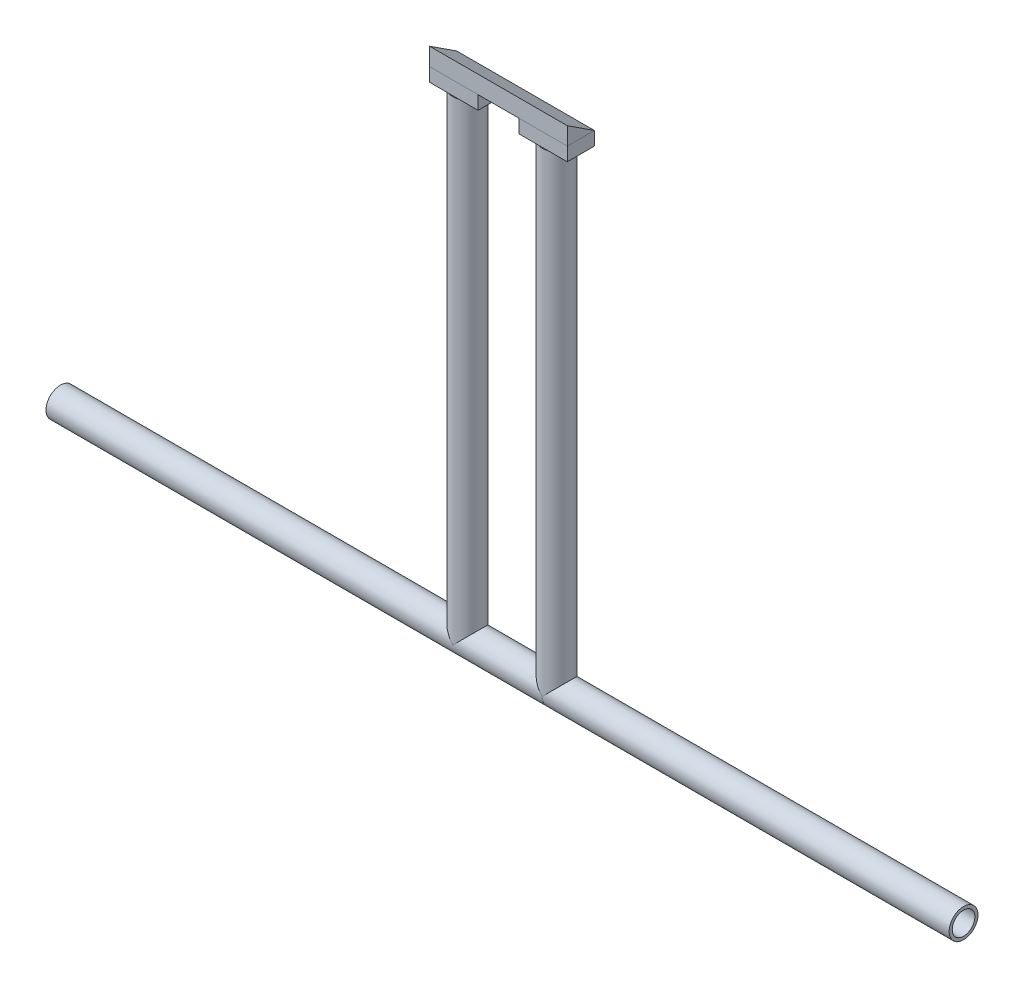
ISO-10303-21;
HEADER;
FILE_DESCRIPTION(('STEP AP214'),'2;1');
FILE_NAME('part.step','',(''),(''),'','','');
FILE_SCHEMA(('AUTOMOTIVE_DESIGN { 1 0 10303 214 1 1 1 1 }'));
ENDSEC;
DATA;
#1=APPLICATION_CONTEXT('core data for automotive mechanical design processes');
#2=APPLICATION_PROTOCOL_DEFINITION('international standard','automotive_design',2000,#1);
#3=PRODUCT_CONTEXT('',#1,'mechanical');
#4=PRODUCT('Part','Part','',(#3));
#5=PRODUCT_RELATED_PRODUCT_CATEGORY('part','',(#4));
#6=PRODUCT_DEFINITION_FORMATION('','',#4);
#7=PRODUCT_DEFINITION_CONTEXT('part definition',#1,'design');
#8=PRODUCT_DEFINITION('design','',#6,#7);
#9=PRODUCT_DEFINITION_SHAPE('','',#8);
#10=(LENGTH_UNIT() NAMED_UNIT(*) SI_UNIT(.MILLI.,.METRE.));
#11=(NAMED_UNIT(*) PLANE_ANGLE_UNIT() SI_UNIT($,.RADIAN.));
#12=(NAMED_UNIT(*) SI_UNIT($,.STERADIAN.) SOLID_ANGLE_UNIT());
#13=UNCERTAINTY_MEASURE_WITH_UNIT(LENGTH_MEASURE(1.E-05),#10,'distance_accuracy_value','');
#14=(GEOMETRIC_REPRESENTATION_CONTEXT(3) GLOBAL_UNCERTAINTY_ASSIGNED_CONTEXT((#13)) GLOBAL_UNIT_ASSIGNED_CONTEXT((#10,
#11,#12)) REPRESENTATION_CONTEXT('',''));
#15=CARTESIAN_POINT('',(0.,0.,0.));
#16=DIRECTION('',(0.,0.,1.));
#17=DIRECTION('',(1.,0.,0.));
#18=AXIS2_PLACEMENT_3D('',#15,#16,#17);
#19=CARTESIAN_POINT('',(41.7485920944329,360.,10.));
#20=DIRECTION('',(0.,-1.,0.));
#21=DIRECTION('',(0.,0.,-1.));
#22=AXIS2_PLACEMENT_3D('',#19,#20,#21);
#23=PLANE('',#22);
#24=DIRECTION('',(0.,0.,-1.));
#25=VECTOR('',#24,1.);
#26=CARTESIAN_POINT('',(17.875,360.,10.));
#27=LINE('',#26,#25);
#28=CARTESIAN_POINT('',(17.875,360.,10.));
#29=VERTEX_POINT('',#28);
#30=CARTESIAN_POINT('',(17.875,360.,-9.99999999999999));
#31=VERTEX_POINT('',#30);
#32=EDGE_CURVE('E67',#29,#31,#27,.T.);
#33=ORIENTED_EDGE('',*,*,#32,.F.);
#34=DIRECTION('',(-1.,0.,0.));
#35=VECTOR('',#34,1.);
#36=CARTESIAN_POINT('',(41.7485920944329,360.,10.));
#37=LINE('',#36,#35);
#38=CARTESIAN_POINT('',(-83.625,360.,10.));
#39=VERTEX_POINT('',#38);
#40=EDGE_CURVE('E89',#29,#39,#37,.T.);
#41=ORIENTED_EDGE('',*,*,#40,.T.);
#42=DIRECTION('',(0.,0.,1.));
#43=VECTOR('',#42,1.);
#44=CARTESIAN_POINT('',(-83.625,360.,10.));
#45=LINE('',#44,#43);
#46=CARTESIAN_POINT('',(-83.625,360.,-10.));
#47=VERTEX_POINT('',#46);
#48=EDGE_CURVE('E93',#47,#39,#45,.T.);
#49=ORIENTED_EDGE('',*,*,#48,.F.);
#50=DIRECTION('',(-1.,0.,0.));
#51=VECTOR('',#50,1.);
#52=CARTESIAN_POINT('',(41.7485920944329,360.,-10.));
#53=LINE('',#52,#51);
#54=EDGE_CURVE('E111',#31,#47,#53,.T.);
#55=ORIENTED_EDGE('',*,*,#54,.F.);
#56=EDGE_LOOP('',(#33,#41,#49,#55));
#57=FACE_BOUND('',#56,.T.);
#58=ADVANCED_FACE('F60',(#57),#23,.T.);
#59=CARTESIAN_POINT('',(41.7485920944329,373.036425871049,10.));
#60=DIRECTION('',(0.,0.837745736832952,-0.546060509850525));
#61=DIRECTION('',(0.,0.546060509850525,0.837745736832952));
#62=AXIS2_PLACEMENT_3D('',#59,#60,#61);
#63=PLANE('',#62);
#64=DIRECTION('',(0.,0.546060509850525,0.837745736832952));
#65=VECTOR('',#64,1.);
#66=CARTESIAN_POINT('',(17.875,373.036425871049,10.));
#67=LINE('',#66,#65);
#68=CARTESIAN_POINT('',(17.875,373.036425871049,10.));
#69=VERTEX_POINT('',#68);
#70=EDGE_CURVE('E113',#31,#69,#67,.T.);
#71=ORIENTED_EDGE('',*,*,#70,.F.);
#72=ORIENTED_EDGE('',*,*,#54,.T.);
#73=DIRECTION('',(0.,-0.546060509850525,-0.837745736832952));
#74=VECTOR('',#73,1.);
#75=CARTESIAN_POINT('',(-83.625,373.036425871049,10.));
#76=LINE('',#75,#74);
#77=CARTESIAN_POINT('',(-83.625,373.036425871049,10.));
#78=VERTEX_POINT('',#77);
#79=EDGE_CURVE('E97',#78,#47,#76,.T.);
#80=ORIENTED_EDGE('',*,*,#79,.F.);
#81=DIRECTION('',(-1.,0.,0.));
#82=VECTOR('',#81,1.);
#83=CARTESIAN_POINT('',(41.7485920944329,373.036425871049,10.));
#84=LINE('',#83,#82);
#85=EDGE_CURVE('E96',#69,#78,#84,.T.);
#86=ORIENTED_EDGE('',*,*,#85,.F.);
#87=EDGE_LOOP('',(#71,#72,#80,#86));
#88=FACE_BOUND('',#87,.T.);
#89=ADVANCED_FACE('F116',(#88),#63,.T.);
#90=CARTESIAN_POINT('',(41.7485920944329,360.,10.));
#91=DIRECTION('',(0.,0.,1.));
#92=DIRECTION('',(1.,0.,0.));
#93=AXIS2_PLACEMENT_3D('',#90,#91,#92);
#94=PLANE('',#93);
#95=DIRECTION('',(0.,-1.,0.));
#96=VECTOR('',#95,1.);
#97=CARTESIAN_POINT('',(17.875,360.,10.));
#98=LINE('',#97,#96);
#99=EDGE_CURVE('E13',#69,#29,#98,.T.);
#100=ORIENTED_EDGE('',*,*,#99,.F.);
#101=ORIENTED_EDGE('',*,*,#85,.T.);
#102=DIRECTION('',(0.,1.,0.));
#103=VECTOR('',#102,1.);
#104=CARTESIAN_POINT('',(-83.625,360.,10.));
#105=LINE('',#104,#103);
#106=EDGE_CURVE('E99',#39,#78,#105,.T.);
#107=ORIENTED_EDGE('',*,*,#106,.F.);
#108=ORIENTED_EDGE('',*,*,#40,.F.);
#109=EDGE_LOOP('',(#100,#101,#107,#108));
#110=FACE_BOUND('',#109,.T.);
#111=ADVANCED_FACE('F100',(#110),#94,.T.);
#112=CARTESIAN_POINT('',(-83.625,0.,0.));
#113=DIRECTION('',(1.,0.,0.));
#114=DIRECTION('',(0.,0.,-1.));
#115=AXIS2_PLACEMENT_3D('',#112,#113,#114);
#116=PLANE('',#115);
#117=ORIENTED_EDGE('',*,*,#48,.T.);
#118=ORIENTED_EDGE('',*,*,#106,.T.);
#119=ORIENTED_EDGE('',*,*,#79,.T.);
#120=EDGE_LOOP('',(#117,#118,#119));
#121=FACE_BOUND('',#120,.T.);
#122=ADVANCED_FACE('F105',(#121),#116,.F.);
#123=CARTESIAN_POINT('',(17.875,360.,-10.));
#124=DIRECTION('',(-1.,0.,0.));
#125=DIRECTION('',(0.,0.,1.));
#126=AXIS2_PLACEMENT_3D('',#123,#124,#125);
#127=PLANE('',#126);
#128=ORIENTED_EDGE('',*,*,#32,.T.);
#129=ORIENTED_EDGE('',*,*,#70,.T.);
#130=ORIENTED_EDGE('',*,*,#99,.T.);
#131=EDGE_LOOP('',(#128,#129,#130));
#132=FACE_BOUND('',#131,.T.);
#133=ADVANCED_FACE('F115',(#132),#127,.F.);
#134=CLOSED_SHELL('',(#58,#89,#111,#122,#133));
#135=MANIFOLD_SOLID_BREP('B2',#134);
#136=CARTESIAN_POINT('',(17.875,360.,-10.));
#137=DIRECTION('',(-1.,0.,0.));
#138=DIRECTION('',(0.,0.,1.));
#139=AXIS2_PLACEMENT_3D('',#136,#137,#138);
#140=PLANE('',#139);
#141=DIRECTION('',(0.,0.,-1.));
#142=VECTOR('',#141,1.);
#143=CARTESIAN_POINT('',(17.875,350.,-10.));
#144=LINE('',#143,#142);
#145=CARTESIAN_POINT('',(17.875,350.,10.));
#146=VERTEX_POINT('',#145);
#147=CARTESIAN_POINT('',(17.875,350.,-10.));
#148=VERTEX_POINT('',#147);
#149=EDGE_CURVE('E231',#146,#148,#144,.T.);
#150=ORIENTED_EDGE('',*,*,#149,.T.);
#151=DIRECTION('',(0.,-1.,0.));
#152=VECTOR('',#151,1.);
#153=CARTESIAN_POINT('',(17.875,360.,-10.));
#154=LINE('',#153,#152);
#155=CARTESIAN_POINT('',(17.875,360.,-10.));
#156=VERTEX_POINT('',#155);
#157=EDGE_CURVE('E58',#156,#148,#154,.T.);
#158=ORIENTED_EDGE('',*,*,#157,.F.);
#159=DIRECTION('',(0.,0.,-1.));
#160=VECTOR('',#159,1.);
#161=CARTESIAN_POINT('',(17.875,360.,-10.));
#162=LINE('',#161,#160);
#163=CARTESIAN_POINT('',(17.875,360.,10.));
#164=VERTEX_POINT('',#163);
#165=EDGE_CURVE('E219',#164,#156,#162,.T.);
#166=ORIENTED_EDGE('',*,*,#165,.F.);
#167=DIRECTION('',(0.,-1.,0.));
#168=VECTOR('',#167,1.);
#169=CARTESIAN_POINT('',(17.875,360.,10.));
#170=LINE('',#169,#168);
#171=EDGE_CURVE('E227',#164,#146,#170,.T.);
#172=ORIENTED_EDGE('',*,*,#171,.T.);
#173=EDGE_LOOP('',(#150,#158,#166,#172));
#174=FACE_BOUND('',#173,.T.);
#175=ADVANCED_FACE('F168',(#174),#140,.F.);
#176=CARTESIAN_POINT('',(-17.875,360.,-10.));
#177=DIRECTION('',(0.,0.,1.));
#178=DIRECTION('',(1.,0.,0.));
#179=AXIS2_PLACEMENT_3D('',#176,#177,#178);
#180=PLANE('',#179);
#181=DIRECTION('',(-1.,0.,0.));
#182=VECTOR('',#181,1.);
#183=CARTESIAN_POINT('',(-17.875,350.,-10.));
#184=LINE('',#183,#182);
#185=CARTESIAN_POINT('',(-17.875,350.,-10.));
#186=VERTEX_POINT('',#185);
#187=EDGE_CURVE('E223',#148,#186,#184,.T.);
#188=ORIENTED_EDGE('',*,*,#187,.T.);
#189=DIRECTION('',(0.,-1.,0.));
#190=VECTOR('',#189,1.);
#191=CARTESIAN_POINT('',(-17.875,360.,-10.));
#192=LINE('',#191,#190);
#193=CARTESIAN_POINT('',(-17.875,360.,-10.));
#194=VERTEX_POINT('',#193);
#195=EDGE_CURVE('E176',#194,#186,#192,.T.);
#196=ORIENTED_EDGE('',*,*,#195,.F.);
#197=DIRECTION('',(-1.,0.,0.));
#198=VECTOR('',#197,1.);
#199=CARTESIAN_POINT('',(-17.875,360.,-10.));
#200=LINE('',#199,#198);
#201=EDGE_CURVE('E214',#156,#194,#200,.T.);
#202=ORIENTED_EDGE('',*,*,#201,.F.);
#203=ORIENTED_EDGE('',*,*,#157,.T.);
#204=EDGE_LOOP('',(#188,#196,#202,#203));
#205=FACE_BOUND('',#204,.T.);
#206=ADVANCED_FACE('F222',(#205),#180,.F.);
#207=CARTESIAN_POINT('',(-17.875,360.,-10.));
#208=DIRECTION('',(1.,0.,0.));
#209=DIRECTION('',(0.,0.,-1.));
#210=AXIS2_PLACEMENT_3D('',#207,#208,#209);
#211=PLANE('',#210);
#212=DIRECTION('',(0.,0.,1.));
#213=VECTOR('',#212,1.);
#214=CARTESIAN_POINT('',(-17.875,350.,-10.));
#215=LINE('',#214,#213);
#216=CARTESIAN_POINT('',(-17.875,350.,10.));
#217=VERTEX_POINT('',#216);
#218=EDGE_CURVE('E201',#186,#217,#215,.T.);
#219=ORIENTED_EDGE('',*,*,#218,.T.);
#220=DIRECTION('',(0.,-1.,0.));
#221=VECTOR('',#220,1.);
#222=CARTESIAN_POINT('',(-17.875,360.,10.));
#223=LINE('',#222,#221);
#224=CARTESIAN_POINT('',(-17.875,360.,10.));
#225=VERTEX_POINT('',#224);
#226=EDGE_CURVE('E224',#225,#217,#223,.T.);
#227=ORIENTED_EDGE('',*,*,#226,.F.);
#228=DIRECTION('',(0.,0.,1.));
#229=VECTOR('',#228,1.);
#230=CARTESIAN_POINT('',(-17.875,360.,-10.));
#231=LINE('',#230,#229);
#232=EDGE_CURVE('E217',#194,#225,#231,.T.);
#233=ORIENTED_EDGE('',*,*,#232,.F.);
#234=ORIENTED_EDGE('',*,*,#195,.T.);
#235=EDGE_LOOP('',(#219,#227,#233,#234));
#236=FACE_BOUND('',#235,.T.);
#237=ADVANCED_FACE('F225',(#236),#211,.F.);
#238=CARTESIAN_POINT('',(-17.875,360.,10.));
#239=DIRECTION('',(0.,0.,-1.));
#240=DIRECTION('',(-1.,0.,0.));
#241=AXIS2_PLACEMENT_3D('',#238,#239,#240);
#242=PLANE('',#241);
#243=DIRECTION('',(1.,0.,0.));
#244=VECTOR('',#243,1.);
#245=CARTESIAN_POINT('',(-17.875,350.,10.));
#246=LINE('',#245,#244);
#247=EDGE_CURVE('E207',#217,#146,#246,.T.);
#248=ORIENTED_EDGE('',*,*,#247,.T.);
#249=ORIENTED_EDGE('',*,*,#171,.F.);
#250=DIRECTION('',(1.,0.,0.));
#251=VECTOR('',#250,1.);
#252=CARTESIAN_POINT('',(-17.875,360.,10.));
#253=LINE('',#252,#251);
#254=EDGE_CURVE('E184',#225,#164,#253,.T.);
#255=ORIENTED_EDGE('',*,*,#254,.F.);
#256=ORIENTED_EDGE('',*,*,#226,.T.);
#257=EDGE_LOOP('',(#248,#249,#255,#256));
#258=FACE_BOUND('',#257,.T.);
#259=ADVANCED_FACE('F238',(#258),#242,.F.);
#260=CARTESIAN_POINT('',(0.,360.,0.));
#261=DIRECTION('',(0.,1.,0.));
#262=DIRECTION('',(0.,0.,1.));
#263=AXIS2_PLACEMENT_3D('',#260,#261,#262);
#264=PLANE('',#263);
#265=ORIENTED_EDGE('',*,*,#165,.T.);
#266=ORIENTED_EDGE('',*,*,#201,.T.);
#267=ORIENTED_EDGE('',*,*,#232,.T.);
#268=ORIENTED_EDGE('',*,*,#254,.T.);
#269=EDGE_LOOP('',(#265,#266,#267,#268));
#270=FACE_BOUND('',#269,.T.);
#271=ADVANCED_FACE('F215',(#270),#264,.T.);
#272=CARTESIAN_POINT('',(0.,350.,0.));
#273=DIRECTION('',(0.,1.,0.));
#274=DIRECTION('',(0.,0.,1.));
#275=AXIS2_PLACEMENT_3D('',#272,#273,#274);
#276=PLANE('',#275);
#277=ORIENTED_EDGE('',*,*,#149,.F.);
#278=ORIENTED_EDGE('',*,*,#247,.F.);
#279=ORIENTED_EDGE('',*,*,#218,.F.);
#280=ORIENTED_EDGE('',*,*,#187,.F.);
#281=EDGE_LOOP('',(#277,#278,#279,#280));
#282=FACE_BOUND('',#281,.T.);
#283=ADVANCED_FACE('F241',(#282),#276,.F.);
#284=CLOSED_SHELL('',(#175,#206,#237,#259,#271,#283));
#285=MANIFOLD_SOLID_BREP('B7',#284);
#286=CARTESIAN_POINT('',(-47.875,360.,-10.));
#287=DIRECTION('',(-1.,0.,0.));
#288=DIRECTION('',(0.,0.,1.));
#289=AXIS2_PLACEMENT_3D('',#286,#287,#288);
#290=PLANE('',#289);
#291=DIRECTION('',(0.,0.,-1.));
#292=VECTOR('',#291,1.);
#293=CARTESIAN_POINT('',(-47.875,350.,-10.));
#294=LINE('',#293,#292);
#295=CARTESIAN_POINT('',(-47.875,350.,10.));
#296=VERTEX_POINT('',#295);
#297=CARTESIAN_POINT('',(-47.875,350.,-10.));
#298=VERTEX_POINT('',#297);
#299=EDGE_CURVE('E351',#296,#298,#294,.T.);
#300=ORIENTED_EDGE('',*,*,#299,.T.);
#301=DIRECTION('',(0.,-1.,0.));
#302=VECTOR('',#301,1.);
#303=CARTESIAN_POINT('',(-47.875,360.,-10.));
#304=LINE('',#303,#302);
#305=CARTESIAN_POINT('',(-47.875,360.,-10.));
#306=VERTEX_POINT('',#305);
#307=EDGE_CURVE('E166',#306,#298,#304,.T.);
#308=ORIENTED_EDGE('',*,*,#307,.F.);
#309=DIRECTION('',(0.,0.,-1.));
#310=VECTOR('',#309,1.);
#311=CARTESIAN_POINT('',(-47.875,360.,-10.));
#312=LINE('',#311,#310);
#313=CARTESIAN_POINT('',(-47.875,360.,10.));
#314=VERTEX_POINT('',#313);
#315=EDGE_CURVE('E339',#314,#306,#312,.T.);
#316=ORIENTED_EDGE('',*,*,#315,.F.);
#317=DIRECTION('',(0.,-1.,0.));
#318=VECTOR('',#317,1.);
#319=CARTESIAN_POINT('',(-47.875,360.,10.));
#320=LINE('',#319,#318);
#321=EDGE_CURVE('E347',#314,#296,#320,.T.);
#322=ORIENTED_EDGE('',*,*,#321,.T.);
#323=EDGE_LOOP('',(#300,#308,#316,#322));
#324=FACE_BOUND('',#323,.T.);
#325=ADVANCED_FACE('F288',(#324),#290,.F.);
#326=CARTESIAN_POINT('',(-83.625,360.,-10.));
#327=DIRECTION('',(0.,0.,1.));
#328=DIRECTION('',(1.,0.,0.));
#329=AXIS2_PLACEMENT_3D('',#326,#327,#328);
#330=PLANE('',#329);
#331=DIRECTION('',(-1.,0.,0.));
#332=VECTOR('',#331,1.);
#333=CARTESIAN_POINT('',(-83.625,350.,-10.));
#334=LINE('',#333,#332);
#335=CARTESIAN_POINT('',(-83.625,350.,-10.));
#336=VERTEX_POINT('',#335);
#337=EDGE_CURVE('E343',#298,#336,#334,.T.);
#338=ORIENTED_EDGE('',*,*,#337,.T.);
#339=DIRECTION('',(0.,-1.,0.));
#340=VECTOR('',#339,1.);
#341=CARTESIAN_POINT('',(-83.625,360.,-10.));
#342=LINE('',#341,#340);
#343=CARTESIAN_POINT('',(-83.625,360.,-10.));
#344=VERTEX_POINT('',#343);
#345=EDGE_CURVE('E296',#344,#336,#342,.T.);
#346=ORIENTED_EDGE('',*,*,#345,.F.);
#347=DIRECTION('',(-1.,0.,0.));
#348=VECTOR('',#347,1.);
#349=CARTESIAN_POINT('',(-83.625,360.,-10.));
#350=LINE('',#349,#348);
#351=EDGE_CURVE('E334',#306,#344,#350,.T.);
#352=ORIENTED_EDGE('',*,*,#351,.F.);
#353=ORIENTED_EDGE('',*,*,#307,.T.);
#354=EDGE_LOOP('',(#338,#346,#352,#353));
#355=FACE_BOUND('',#354,.T.);
#356=ADVANCED_FACE('F342',(#355),#330,.F.);
#357=CARTESIAN_POINT('',(-83.625,360.,-10.));
#358=DIRECTION('',(1.,0.,0.));
#359=DIRECTION('',(0.,0.,-1.));
#360=AXIS2_PLACEMENT_3D('',#357,#358,#359);
#361=PLANE('',#360);
#362=DIRECTION('',(0.,0.,1.));
#363=VECTOR('',#362,1.);
#364=CARTESIAN_POINT('',(-83.625,350.,-10.));
#365=LINE('',#364,#363);
#366=CARTESIAN_POINT('',(-83.625,350.,10.));
#367=VERTEX_POINT('',#366);
#368=EDGE_CURVE('E321',#336,#367,#365,.T.);
#369=ORIENTED_EDGE('',*,*,#368,.T.);
#370=DIRECTION('',(0.,-1.,0.));
#371=VECTOR('',#370,1.);
#372=CARTESIAN_POINT('',(-83.625,360.,10.));
#373=LINE('',#372,#371);
#374=CARTESIAN_POINT('',(-83.625,360.,10.));
#375=VERTEX_POINT('',#374);
#376=EDGE_CURVE('E344',#375,#367,#373,.T.);
#377=ORIENTED_EDGE('',*,*,#376,.F.);
#378=DIRECTION('',(0.,0.,1.));
#379=VECTOR('',#378,1.);
#380=CARTESIAN_POINT('',(-83.625,360.,-10.));
#381=LINE('',#380,#379);
#382=EDGE_CURVE('E337',#344,#375,#381,.T.);
#383=ORIENTED_EDGE('',*,*,#382,.F.);
#384=ORIENTED_EDGE('',*,*,#345,.T.);
#385=EDGE_LOOP('',(#369,#377,#383,#384));
#386=FACE_BOUND('',#385,.T.);
#387=ADVANCED_FACE('F345',(#386),#361,.F.);
#388=CARTESIAN_POINT('',(-83.625,360.,10.));
#389=DIRECTION('',(0.,0.,-1.));
#390=DIRECTION('',(-1.,0.,0.));
#391=AXIS2_PLACEMENT_3D('',#388,#389,#390);
#392=PLANE('',#391);
#393=DIRECTION('',(1.,0.,0.));
#394=VECTOR('',#393,1.);
#395=CARTESIAN_POINT('',(-83.625,350.,10.));
#396=LINE('',#395,#394);
#397=EDGE_CURVE('E327',#367,#296,#396,.T.);
#398=ORIENTED_EDGE('',*,*,#397,.T.);
#399=ORIENTED_EDGE('',*,*,#321,.F.);
#400=DIRECTION('',(1.,0.,0.));
#401=VECTOR('',#400,1.);
#402=CARTESIAN_POINT('',(-83.625,360.,10.));
#403=LINE('',#402,#401);
#404=EDGE_CURVE('E304',#375,#314,#403,.T.);
#405=ORIENTED_EDGE('',*,*,#404,.F.);
#406=ORIENTED_EDGE('',*,*,#376,.T.);
#407=EDGE_LOOP('',(#398,#399,#405,#406));
#408=FACE_BOUND('',#407,.T.);
#409=ADVANCED_FACE('F358',(#408),#392,.F.);
#410=CARTESIAN_POINT('',(0.,360.,0.));
#411=DIRECTION('',(0.,1.,0.));
#412=DIRECTION('',(0.,0.,1.));
#413=AXIS2_PLACEMENT_3D('',#410,#411,#412);
#414=PLANE('',#413);
#415=ORIENTED_EDGE('',*,*,#315,.T.);
#416=ORIENTED_EDGE('',*,*,#351,.T.);
#417=ORIENTED_EDGE('',*,*,#382,.T.);
#418=ORIENTED_EDGE('',*,*,#404,.T.);
#419=EDGE_LOOP('',(#415,#416,#417,#418));
#420=FACE_BOUND('',#419,.T.);
#421=ADVANCED_FACE('F335',(#420),#414,.T.);
#422=CARTESIAN_POINT('',(0.,350.,0.));
#423=DIRECTION('',(0.,1.,0.));
#424=DIRECTION('',(0.,0.,1.));
#425=AXIS2_PLACEMENT_3D('',#422,#423,#424);
#426=PLANE('',#425);
#427=ORIENTED_EDGE('',*,*,#299,.F.);
#428=ORIENTED_EDGE('',*,*,#397,.F.);
#429=ORIENTED_EDGE('',*,*,#368,.F.);
#430=ORIENTED_EDGE('',*,*,#337,.F.);
#431=EDGE_LOOP('',(#427,#428,#429,#430));
#432=FACE_BOUND('',#431,.T.);
#433=ADVANCED_FACE('F361',(#432),#426,.F.);
#434=CLOSED_SHELL('',(#325,#356,#387,#409,#421,#433));
#435=MANIFOLD_SOLID_BREP('B52',#434);
#436=CARTESIAN_POINT('',(0.,0.,0.));
#437=DIRECTION('',(1.,0.,0.));
#438=DIRECTION('',(0.,1.,0.));
#439=AXIS2_PLACEMENT_3D('',#436,#437,#438);
#440=CYLINDRICAL_SURFACE('',#439,8.35);
#441=CARTESIAN_POINT('',(300.,0.,0.));
#442=DIRECTION('',(-1.,0.,0.));
#443=DIRECTION('',(0.,-1.,0.));
#444=AXIS2_PLACEMENT_3D('',#441,#442,#443);
#445=CIRCLE('',#444,8.35);
#446=CARTESIAN_POINT('',(300.,-8.35,0.));
#447=VERTEX_POINT('',#446);
#448=EDGE_CURVE('E415',#447,#447,#445,.T.);
#449=ORIENTED_EDGE('',*,*,#448,.F.);
#450=EDGE_LOOP('',(#449));
#451=FACE_BOUND('',#450,.T.);
#452=CARTESIAN_POINT('',(0.,0.,0.));
#453=DIRECTION('',(-1.,0.,0.));
#454=DIRECTION('',(0.,-1.,0.));
#455=AXIS2_PLACEMENT_3D('',#452,#453,#454);
#456=CIRCLE('',#455,8.35);
#457=CARTESIAN_POINT('',(0.,-8.35,0.));
#458=VERTEX_POINT('',#457);
#459=EDGE_CURVE('E411',#458,#458,#456,.T.);
#460=ORIENTED_EDGE('',*,*,#459,.T.);
#461=EDGE_LOOP('',(#460));
#462=FACE_BOUND('',#461,.T.);
#463=ADVANCED_FACE('F407',(#451,#462),#440,.F.);
#464=CARTESIAN_POINT('',(0.,0.,0.));
#465=DIRECTION('',(1.,0.,0.));
#466=DIRECTION('',(0.,1.,0.));
#467=AXIS2_PLACEMENT_3D('',#464,#465,#466);
#468=CYLINDRICAL_SURFACE('',#467,10.65);
#469=CARTESIAN_POINT('',(300.,0.,0.));
#470=DIRECTION('',(-1.,0.,0.));
#471=DIRECTION('',(0.,-1.,0.));
#472=AXIS2_PLACEMENT_3D('',#469,#470,#471);
#473=CIRCLE('',#472,10.65);
#474=CARTESIAN_POINT('',(300.,-10.65,0.));
#475=VERTEX_POINT('',#474);
#476=EDGE_CURVE('E419',#475,#475,#473,.T.);
#477=ORIENTED_EDGE('',*,*,#476,.T.);
#478=EDGE_LOOP('',(#477));
#479=FACE_BOUND('',#478,.T.);
#480=CARTESIAN_POINT('',(0.,0.,0.));
#481=DIRECTION('',(-1.,0.,0.));
#482=DIRECTION('',(0.,-1.,0.));
#483=AXIS2_PLACEMENT_3D('',#480,#481,#482);
#484=CIRCLE('',#483,10.65);
#485=CARTESIAN_POINT('',(0.,-10.65,0.));
#486=VERTEX_POINT('',#485);
#487=EDGE_CURVE('E287',#486,#486,#484,.T.);
#488=ORIENTED_EDGE('',*,*,#487,.F.);
#489=EDGE_LOOP('',(#488));
#490=FACE_BOUND('',#489,.T.);
#491=ADVANCED_FACE('F434',(#479,#490),#468,.T.);
#492=CARTESIAN_POINT('',(300.,0.,0.));
#493=DIRECTION('',(-1.,0.,0.));
#494=DIRECTION('',(0.,-1.,0.));
#495=AXIS2_PLACEMENT_3D('',#492,#493,#494);
#496=PLANE('',#495);
#497=ORIENTED_EDGE('',*,*,#448,.T.);
#498=EDGE_LOOP('',(#497));
#499=FACE_BOUND('',#498,.T.);
#500=ORIENTED_EDGE('',*,*,#476,.F.);
#501=EDGE_LOOP('',(#500));
#502=FACE_BOUND('',#501,.T.);
#503=ADVANCED_FACE('F430',(#499,#502),#496,.F.);
#504=CARTESIAN_POINT('',(0.,0.,0.));
#505=DIRECTION('',(-1.,0.,0.));
#506=DIRECTION('',(0.,-1.,0.));
#507=AXIS2_PLACEMENT_3D('',#504,#505,#506);
#508=PLANE('',#507);
#509=ORIENTED_EDGE('',*,*,#459,.F.);
#510=EDGE_LOOP('',(#509));
#511=FACE_BOUND('',#510,.T.);
#512=ORIENTED_EDGE('',*,*,#487,.T.);
#513=EDGE_LOOP('',(#512));
#514=FACE_BOUND('',#513,.T.);
#515=ADVANCED_FACE('F409',(#511,#514),#508,.T.);
#516=CLOSED_SHELL('',(#463,#491,#503,#515));
#517=MANIFOLD_SOLID_BREP('B160',#516);
#518=CARTESIAN_POINT('',(-365.75,0.,0.));
#519=DIRECTION('',(1.,0.,0.));
#520=DIRECTION('',(0.,1.,0.));
#521=AXIS2_PLACEMENT_3D('',#518,#519,#520);
#522=CYLINDRICAL_SURFACE('',#521,8.35);
#523=CARTESIAN_POINT('',(-365.75,0.,0.));
#524=DIRECTION('',(-1.,0.,0.));
#525=DIRECTION('',(0.,-1.,0.));
#526=AXIS2_PLACEMENT_3D('',#523,#524,#525);
#527=CIRCLE('',#526,8.35);
#528=CARTESIAN_POINT('',(-365.75,-8.35000000000004,0.));
#529=VERTEX_POINT('',#528);
#530=EDGE_CURVE('E516',#529,#529,#527,.T.);
#531=ORIENTED_EDGE('',*,*,#530,.T.);
#532=EDGE_LOOP('',(#531));
#533=FACE_BOUND('',#532,.T.);
#534=CARTESIAN_POINT('',(0.,0.,0.));
#535=DIRECTION('',(1.,0.,0.));
#536=DIRECTION('',(0.,1.,0.));
#537=AXIS2_PLACEMENT_3D('',#534,#535,#536);
#538=CIRCLE('',#537,8.35);
#539=CARTESIAN_POINT('',(0.,8.35,0.));
#540=VERTEX_POINT('',#539);
#541=EDGE_CURVE('E504',#540,#540,#538,.T.);
#542=ORIENTED_EDGE('',*,*,#541,.T.);
#543=EDGE_LOOP('',(#542));
#544=FACE_BOUND('',#543,.T.);
#545=ADVANCED_FACE('F500',(#533,#544),#522,.F.);
#546=CARTESIAN_POINT('',(-365.75,0.,0.));
#547=DIRECTION('',(1.,0.,0.));
#548=DIRECTION('',(0.,1.,0.));
#549=AXIS2_PLACEMENT_3D('',#546,#547,#548);
#550=CYLINDRICAL_SURFACE('',#549,10.65);
#551=CARTESIAN_POINT('',(-365.75,0.,0.));
#552=DIRECTION('',(-1.,0.,0.));
#553=DIRECTION('',(0.,-1.,0.));
#554=AXIS2_PLACEMENT_3D('',#551,#552,#553);
#555=CIRCLE('',#554,10.65);
#556=CARTESIAN_POINT('',(-365.75,-10.65,0.));
#557=VERTEX_POINT('',#556);
#558=EDGE_CURVE('E509',#557,#557,#555,.T.);
#559=ORIENTED_EDGE('',*,*,#558,.F.);
#560=EDGE_LOOP('',(#559));
#561=FACE_BOUND('',#560,.T.);
#562=CARTESIAN_POINT('',(0.,0.,0.));
#563=DIRECTION('',(1.,0.,0.));
#564=DIRECTION('',(0.,1.,0.));
#565=AXIS2_PLACEMENT_3D('',#562,#563,#564);
#566=CIRCLE('',#565,10.65);
#567=CARTESIAN_POINT('',(0.,10.65,0.));
#568=VERTEX_POINT('',#567);
#569=EDGE_CURVE('E406',#568,#568,#566,.T.);
#570=ORIENTED_EDGE('',*,*,#569,.F.);
#571=EDGE_LOOP('',(#570));
#572=FACE_BOUND('',#571,.T.);
#573=ADVANCED_FACE('F531',(#561,#572),#550,.T.);
#574=CARTESIAN_POINT('',(-365.75,0.,0.));
#575=DIRECTION('',(-1.,0.,0.));
#576=DIRECTION('',(0.,-1.,0.));
#577=AXIS2_PLACEMENT_3D('',#574,#575,#576);
#578=PLANE('',#577);
#579=ORIENTED_EDGE('',*,*,#530,.F.);
#580=EDGE_LOOP('',(#579));
#581=FACE_BOUND('',#580,.T.);
#582=ORIENTED_EDGE('',*,*,#558,.T.);
#583=EDGE_LOOP('',(#582));
#584=FACE_BOUND('',#583,.T.);
#585=ADVANCED_FACE('F527',(#581,#584),#578,.T.);
#586=CARTESIAN_POINT('',(0.,0.,0.));
#587=DIRECTION('',(1.,0.,0.));
#588=DIRECTION('',(0.,1.,0.));
#589=AXIS2_PLACEMENT_3D('',#586,#587,#588);
#590=PLANE('',#589);
#591=ORIENTED_EDGE('',*,*,#541,.F.);
#592=EDGE_LOOP('',(#591));
#593=FACE_BOUND('',#592,.T.);
#594=ORIENTED_EDGE('',*,*,#569,.T.);
#595=EDGE_LOOP('',(#594));
#596=FACE_BOUND('',#595,.T.);
#597=ADVANCED_FACE('F502',(#593,#596),#590,.T.);
#598=CLOSED_SHELL('',(#545,#573,#585,#597));
#599=MANIFOLD_SOLID_BREP('B282',#598);
#600=CARTESIAN_POINT('',(0.,350.,0.));
#601=DIRECTION('',(0.,-1.,0.));
#602=DIRECTION('',(0.,0.,-1.));
#603=AXIS2_PLACEMENT_3D('',#600,#601,#602);
#604=CYLINDRICAL_SURFACE('',#603,8.35);
#605=CARTESIAN_POINT('',(0.,350.,0.));
#606=DIRECTION('',(0.,1.,0.));
#607=DIRECTION('',(0.,0.,1.));
#608=AXIS2_PLACEMENT_3D('',#605,#606,#607);
#609=CIRCLE('',#608,8.35);
#610=CARTESIAN_POINT('',(0.,350.,8.35));
#611=VERTEX_POINT('',#610);
#612=EDGE_CURVE('E604',#611,#611,#609,.T.);
#613=ORIENTED_EDGE('',*,*,#612,.T.);
#614=EDGE_LOOP('',(#613));
#615=FACE_BOUND('',#614,.T.);
#616=CARTESIAN_POINT('',(0.,0.,0.));
#617=DIRECTION('',(0.,1.,0.));
#618=DIRECTION('',(0.,0.,1.));
#619=AXIS2_PLACEMENT_3D('',#616,#617,#618);
#620=CIRCLE('',#619,8.35);
#621=CARTESIAN_POINT('',(0.,0.,8.35));
#622=VERTEX_POINT('',#621);
#623=EDGE_CURVE('E610',#622,#622,#620,.T.);
#624=ORIENTED_EDGE('',*,*,#623,.F.);
#625=EDGE_LOOP('',(#624));
#626=FACE_BOUND('',#625,.T.);
#627=ADVANCED_FACE('F597',(#615,#626),#604,.F.);
#628=CARTESIAN_POINT('',(0.,350.,0.));
#629=DIRECTION('',(0.,-1.,0.));
#630=DIRECTION('',(0.,0.,-1.));
#631=AXIS2_PLACEMENT_3D('',#628,#629,#630);
#632=CYLINDRICAL_SURFACE('',#631,10.65);
#633=CARTESIAN_POINT('',(0.,350.,0.));
#634=DIRECTION('',(0.,1.,0.));
#635=DIRECTION('',(0.,0.,1.));
#636=AXIS2_PLACEMENT_3D('',#633,#634,#635);
#637=CIRCLE('',#636,10.65);
#638=CARTESIAN_POINT('',(0.,350.,10.65));
#639=VERTEX_POINT('',#638);
#640=EDGE_CURVE('E499',#639,#639,#637,.T.);
#641=ORIENTED_EDGE('',*,*,#640,.F.);
#642=EDGE_LOOP('',(#641));
#643=FACE_BOUND('',#642,.T.);
#644=CARTESIAN_POINT('',(0.,0.,0.));
#645=DIRECTION('',(0.,1.,0.));
#646=DIRECTION('',(0.,0.,1.));
#647=AXIS2_PLACEMENT_3D('',#644,#645,#646);
#648=CIRCLE('',#647,10.65);
#649=CARTESIAN_POINT('',(0.,0.,10.65));
#650=VERTEX_POINT('',#649);
#651=EDGE_CURVE('E600',#650,#650,#648,.T.);
#652=ORIENTED_EDGE('',*,*,#651,.T.);
#653=EDGE_LOOP('',(#652));
#654=FACE_BOUND('',#653,.T.);
#655=ADVANCED_FACE('F617',(#643,#654),#632,.T.);
#656=CARTESIAN_POINT('',(0.,350.,0.));
#657=DIRECTION('',(0.,1.,0.));
#658=DIRECTION('',(0.,0.,1.));
#659=AXIS2_PLACEMENT_3D('',#656,#657,#658);
#660=PLANE('',#659);
#661=ORIENTED_EDGE('',*,*,#612,.F.);
#662=EDGE_LOOP('',(#661));
#663=FACE_BOUND('',#662,.T.);
#664=ORIENTED_EDGE('',*,*,#640,.T.);
#665=EDGE_LOOP('',(#664));
#666=FACE_BOUND('',#665,.T.);
#667=ADVANCED_FACE('F621',(#663,#666),#660,.T.);
#668=CARTESIAN_POINT('',(0.,0.,0.));
#669=DIRECTION('',(0.,1.,0.));
#670=DIRECTION('',(0.,0.,1.));
#671=AXIS2_PLACEMENT_3D('',#668,#669,#670);
#672=PLANE('',#671);
#673=ORIENTED_EDGE('',*,*,#623,.T.);
#674=EDGE_LOOP('',(#673));
#675=FACE_BOUND('',#674,.T.);
#676=ORIENTED_EDGE('',*,*,#651,.F.);
#677=EDGE_LOOP('',(#676));
#678=FACE_BOUND('',#677,.T.);
#679=ADVANCED_FACE('F619',(#675,#678),#672,.F.);
#680=CLOSED_SHELL('',(#627,#655,#667,#679));
#681=MANIFOLD_SOLID_BREP('B401',#680);
#682=CARTESIAN_POINT('',(-65.7499999999999,350.,0.));
#683=DIRECTION('',(0.,-1.,0.));
#684=DIRECTION('',(0.,0.,-1.));
#685=AXIS2_PLACEMENT_3D('',#682,#683,#684);
#686=CYLINDRICAL_SURFACE('',#685,8.35);
#687=CARTESIAN_POINT('',(-65.7499999999999,350.,0.));
#688=DIRECTION('',(0.,1.,0.));
#689=DIRECTION('',(0.,0.,1.));
#690=AXIS2_PLACEMENT_3D('',#687,#688,#689);
#691=CIRCLE('',#690,8.35);
#692=CARTESIAN_POINT('',(-65.7499999999999,350.,8.35));
#693=VERTEX_POINT('',#692);
#694=EDGE_CURVE('E666',#693,#693,#691,.T.);
#695=ORIENTED_EDGE('',*,*,#694,.T.);
#696=EDGE_LOOP('',(#695));
#697=FACE_BOUND('',#696,.T.);
#698=CARTESIAN_POINT('',(-65.7499999999999,0.,0.));
#699=DIRECTION('',(0.,1.,0.));
#700=DIRECTION('',(0.,0.,1.));
#701=AXIS2_PLACEMENT_3D('',#698,#699,#700);
#702=CIRCLE('',#701,8.35);
#703=CARTESIAN_POINT('',(-65.7499999999999,0.,8.35));
#704=VERTEX_POINT('',#703);
#705=EDGE_CURVE('E672',#704,#704,#702,.T.);
#706=ORIENTED_EDGE('',*,*,#705,.F.);
#707=EDGE_LOOP('',(#706));
#708=FACE_BOUND('',#707,.T.);
#709=ADVANCED_FACE('F659',(#697,#708),#686,.F.);
#710=CARTESIAN_POINT('',(-65.7499999999999,350.,0.));
#711=DIRECTION('',(0.,-1.,0.));
#712=DIRECTION('',(0.,0.,-1.));
#713=AXIS2_PLACEMENT_3D('',#710,#711,#712);
#714=CYLINDRICAL_SURFACE('',#713,10.65);
#715=CARTESIAN_POINT('',(-65.7499999999999,350.,0.));
#716=DIRECTION('',(0.,1.,0.));
#717=DIRECTION('',(0.,0.,1.));
#718=AXIS2_PLACEMENT_3D('',#715,#716,#717);
#719=CIRCLE('',#718,10.65);
#720=CARTESIAN_POINT('',(-65.7499999999999,350.,10.65));
#721=VERTEX_POINT('',#720);
#722=EDGE_CURVE('E596',#721,#721,#719,.T.);
#723=ORIENTED_EDGE('',*,*,#722,.F.);
#724=EDGE_LOOP('',(#723));
#725=FACE_BOUND('',#724,.T.);
#726=CARTESIAN_POINT('',(-65.7499999999999,0.,0.));
#727=DIRECTION('',(0.,1.,0.));
#728=DIRECTION('',(0.,0.,1.));
#729=AXIS2_PLACEMENT_3D('',#726,#727,#728);
#730=CIRCLE('',#729,10.65);
#731=CARTESIAN_POINT('',(-65.7499999999999,0.,10.65));
#732=VERTEX_POINT('',#731);
#733=EDGE_CURVE('E662',#732,#732,#730,.T.);
#734=ORIENTED_EDGE('',*,*,#733,.T.);
#735=EDGE_LOOP('',(#734));
#736=FACE_BOUND('',#735,.T.);
#737=ADVANCED_FACE('F679',(#725,#736),#714,.T.);
#738=CARTESIAN_POINT('',(-65.7499999999999,350.,0.));
#739=DIRECTION('',(0.,1.,0.));
#740=DIRECTION('',(0.,0.,1.));
#741=AXIS2_PLACEMENT_3D('',#738,#739,#740);
#742=PLANE('',#741);
#743=ORIENTED_EDGE('',*,*,#694,.F.);
#744=EDGE_LOOP('',(#743));
#745=FACE_BOUND('',#744,.T.);
#746=ORIENTED_EDGE('',*,*,#722,.T.);
#747=EDGE_LOOP('',(#746));
#748=FACE_BOUND('',#747,.T.);
#749=ADVANCED_FACE('F683',(#745,#748),#742,.T.);
#750=CARTESIAN_POINT('',(-65.7499999999999,0.,0.));
#751=DIRECTION('',(0.,1.,0.));
#752=DIRECTION('',(0.,0.,1.));
#753=AXIS2_PLACEMENT_3D('',#750,#751,#752);
#754=PLANE('',#753);
#755=ORIENTED_EDGE('',*,*,#705,.T.);
#756=EDGE_LOOP('',(#755));
#757=FACE_BOUND('',#756,.T.);
#758=ORIENTED_EDGE('',*,*,#733,.F.);
#759=EDGE_LOOP('',(#758));
#760=FACE_BOUND('',#759,.T.);
#761=ADVANCED_FACE('F681',(#757,#760),#754,.F.);
#762=CLOSED_SHELL('',(#709,#737,#749,#761));
#763=MANIFOLD_SOLID_BREP('B494',#762);
#764=ADVANCED_BREP_SHAPE_REPRESENTATION('',(#18,#135,#285,#435,#517,#599,#681,#763),#14);
#765=SHAPE_DEFINITION_REPRESENTATION(#9,#764);
ENDSEC;
END-ISO-10303-21;
